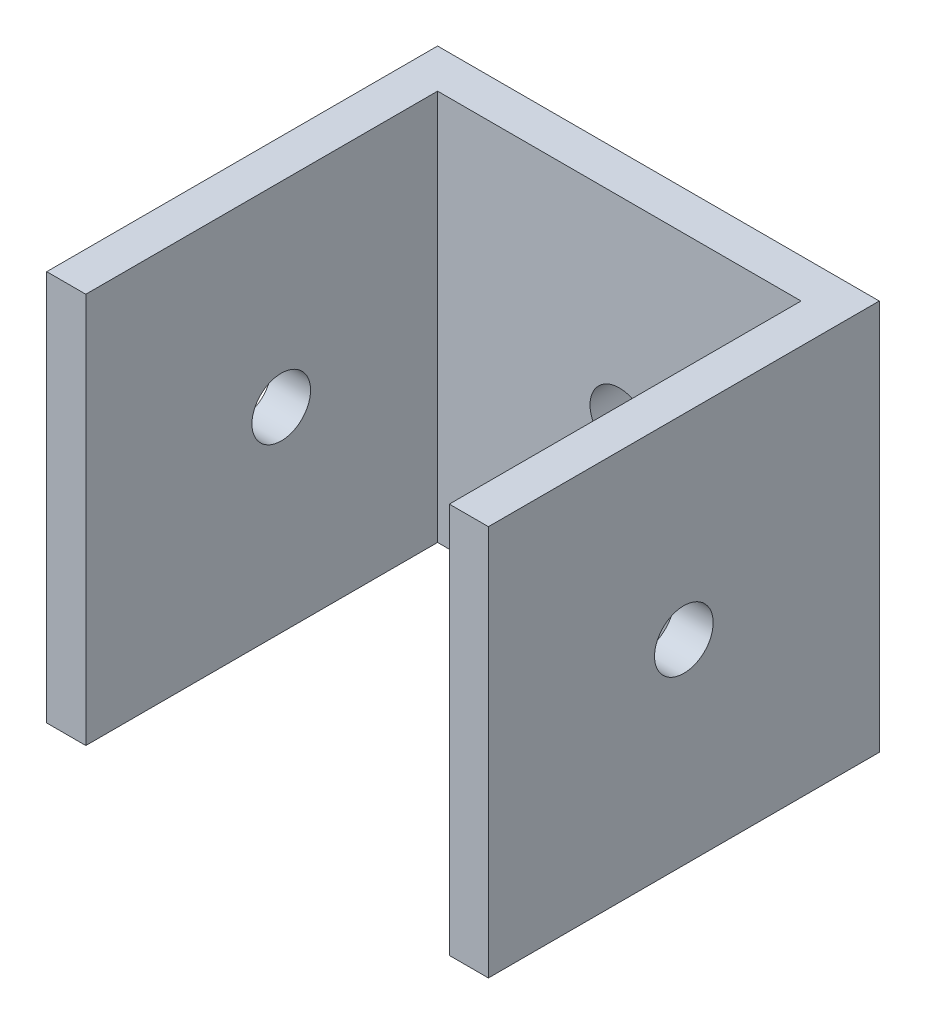
ISO-10303-21;
HEADER;
FILE_DESCRIPTION(('STEP AP214'),'2;1');
FILE_NAME('part.step','',(''),(''),'','','');
FILE_SCHEMA(('AUTOMOTIVE_DESIGN { 1 0 10303 214 1 1 1 1 }'));
ENDSEC;
DATA;
#1=APPLICATION_CONTEXT('core data for automotive mechanical design processes');
#2=APPLICATION_PROTOCOL_DEFINITION('international standard','automotive_design',2000,#1);
#3=PRODUCT_CONTEXT('',#1,'mechanical');
#4=PRODUCT('Part','Part','',(#3));
#5=PRODUCT_RELATED_PRODUCT_CATEGORY('part','',(#4));
#6=PRODUCT_DEFINITION_FORMATION('','',#4);
#7=PRODUCT_DEFINITION_CONTEXT('part definition',#1,'design');
#8=PRODUCT_DEFINITION('design','',#6,#7);
#9=PRODUCT_DEFINITION_SHAPE('','',#8);
#10=(LENGTH_UNIT() NAMED_UNIT(*) SI_UNIT(.MILLI.,.METRE.));
#11=(NAMED_UNIT(*) PLANE_ANGLE_UNIT() SI_UNIT($,.RADIAN.));
#12=(NAMED_UNIT(*) SI_UNIT($,.STERADIAN.) SOLID_ANGLE_UNIT());
#13=UNCERTAINTY_MEASURE_WITH_UNIT(LENGTH_MEASURE(1.E-05),#10,'distance_accuracy_value','');
#14=(GEOMETRIC_REPRESENTATION_CONTEXT(3) GLOBAL_UNCERTAINTY_ASSIGNED_CONTEXT((#13)) GLOBAL_UNIT_ASSIGNED_CONTEXT((#10,
#11,#12)) REPRESENTATION_CONTEXT('',''));
#15=CARTESIAN_POINT('',(0.,0.,0.));
#16=DIRECTION('',(0.,0.,1.));
#17=DIRECTION('',(1.,0.,0.));
#18=AXIS2_PLACEMENT_3D('',#15,#16,#17);
#19=CARTESIAN_POINT('',(-56.5,100.,0.));
#20=DIRECTION('',(1.,0.,0.));
#21=DIRECTION('',(0.,0.,-1.));
#22=AXIS2_PLACEMENT_3D('',#19,#20,#21);
#23=PLANE('',#22);
#24=CARTESIAN_POINT('',(-56.5,50.,50.));
#25=DIRECTION('',(1.,0.,0.));
#26=DIRECTION('',(0.,0.,-1.));
#27=AXIS2_PLACEMENT_3D('',#24,#25,#26);
#28=CIRCLE('',#27,7.5);
#29=CARTESIAN_POINT('',(-56.5,50.,42.5));
#30=VERTEX_POINT('',#29);
#31=EDGE_CURVE('E137',#30,#30,#28,.T.);
#32=ORIENTED_EDGE('',*,*,#31,.T.);
#33=EDGE_LOOP('',(#32));
#34=FACE_BOUND('',#33,.T.);
#35=DIRECTION('',(0.,0.,1.));
#36=VECTOR('',#35,1.);
#37=CARTESIAN_POINT('',(-56.5,0.,0.));
#38=LINE('',#37,#36);
#39=CARTESIAN_POINT('',(-56.5,0.,0.));
#40=VERTEX_POINT('',#39);
#41=CARTESIAN_POINT('',(-56.5,0.,100.));
#42=VERTEX_POINT('',#41);
#43=EDGE_CURVE('E133',#40,#42,#38,.T.);
#44=ORIENTED_EDGE('',*,*,#43,.T.);
#45=DIRECTION('',(0.,-1.,0.));
#46=VECTOR('',#45,1.);
#47=CARTESIAN_POINT('',(-56.5,100.,100.));
#48=LINE('',#47,#46);
#49=CARTESIAN_POINT('',(-56.5,100.,100.));
#50=VERTEX_POINT('',#49);
#51=EDGE_CURVE('E11',#50,#42,#48,.T.);
#52=ORIENTED_EDGE('',*,*,#51,.F.);
#53=DIRECTION('',(0.,0.,1.));
#54=VECTOR('',#53,1.);
#55=CARTESIAN_POINT('',(-56.5,100.,0.));
#56=LINE('',#55,#54);
#57=CARTESIAN_POINT('',(-56.5,100.,0.));
#58=VERTEX_POINT('',#57);
#59=EDGE_CURVE('E148',#58,#50,#56,.T.);
#60=ORIENTED_EDGE('',*,*,#59,.F.);
#61=DIRECTION('',(0.,-1.,0.));
#62=VECTOR('',#61,1.);
#63=CARTESIAN_POINT('',(-56.5,100.,0.));
#64=LINE('',#63,#62);
#65=EDGE_CURVE('E129',#58,#40,#64,.T.);
#66=ORIENTED_EDGE('',*,*,#65,.T.);
#67=EDGE_LOOP('',(#44,#52,#60,#66));
#68=FACE_BOUND('',#67,.T.);
#69=ADVANCED_FACE('F37',(#34,#68),#23,.F.);
#70=CARTESIAN_POINT('',(-56.5,100.,100.));
#71=DIRECTION('',(0.,0.,-1.));
#72=DIRECTION('',(-1.,0.,0.));
#73=AXIS2_PLACEMENT_3D('',#70,#71,#72);
#74=PLANE('',#73);
#75=DIRECTION('',(1.,0.,0.));
#76=VECTOR('',#75,1.);
#77=CARTESIAN_POINT('',(-56.5,0.,100.));
#78=LINE('',#77,#76);
#79=CARTESIAN_POINT('',(-46.5,0.,100.));
#80=VERTEX_POINT('',#79);
#81=EDGE_CURVE('E136',#42,#80,#78,.T.);
#82=ORIENTED_EDGE('',*,*,#81,.T.);
#83=DIRECTION('',(0.,-1.,0.));
#84=VECTOR('',#83,1.);
#85=CARTESIAN_POINT('',(-46.5,100.,100.));
#86=LINE('',#85,#84);
#87=CARTESIAN_POINT('',(-46.5,100.,100.));
#88=VERTEX_POINT('',#87);
#89=EDGE_CURVE('E45',#88,#80,#86,.T.);
#90=ORIENTED_EDGE('',*,*,#89,.F.);
#91=DIRECTION('',(1.,0.,0.));
#92=VECTOR('',#91,1.);
#93=CARTESIAN_POINT('',(-56.5,100.,100.));
#94=LINE('',#93,#92);
#95=EDGE_CURVE('E96',#50,#88,#94,.T.);
#96=ORIENTED_EDGE('',*,*,#95,.F.);
#97=ORIENTED_EDGE('',*,*,#51,.T.);
#98=EDGE_LOOP('',(#82,#90,#96,#97));
#99=FACE_BOUND('',#98,.T.);
#100=ADVANCED_FACE('F214',(#99),#74,.F.);
#101=CARTESIAN_POINT('',(-46.5,100.,100.));
#102=DIRECTION('',(-1.,0.,0.));
#103=DIRECTION('',(0.,0.,1.));
#104=AXIS2_PLACEMENT_3D('',#101,#102,#103);
#105=PLANE('',#104);
#106=CARTESIAN_POINT('',(-46.5,50.,50.));
#107=DIRECTION('',(-1.,0.,0.));
#108=DIRECTION('',(0.,0.,1.));
#109=AXIS2_PLACEMENT_3D('',#106,#107,#108);
#110=CIRCLE('',#109,7.5);
#111=CARTESIAN_POINT('',(-46.5,50.,57.5));
#112=VERTEX_POINT('',#111);
#113=EDGE_CURVE('E183',#112,#112,#110,.T.);
#114=ORIENTED_EDGE('',*,*,#113,.T.);
#115=EDGE_LOOP('',(#114));
#116=FACE_BOUND('',#115,.T.);
#117=DIRECTION('',(0.,0.,-1.));
#118=VECTOR('',#117,1.);
#119=CARTESIAN_POINT('',(-46.5,0.,100.));
#120=LINE('',#119,#118);
#121=CARTESIAN_POINT('',(-46.5,0.,9.99999999999999));
#122=VERTEX_POINT('',#121);
#123=EDGE_CURVE('E139',#80,#122,#120,.T.);
#124=ORIENTED_EDGE('',*,*,#123,.T.);
#125=DIRECTION('',(0.,-1.,0.));
#126=VECTOR('',#125,1.);
#127=CARTESIAN_POINT('',(-46.5,100.,9.99999999999999));
#128=LINE('',#127,#126);
#129=CARTESIAN_POINT('',(-46.5,100.,9.99999999999999));
#130=VERTEX_POINT('',#129);
#131=EDGE_CURVE('E155',#130,#122,#128,.T.);
#132=ORIENTED_EDGE('',*,*,#131,.F.);
#133=DIRECTION('',(0.,0.,-1.));
#134=VECTOR('',#133,1.);
#135=CARTESIAN_POINT('',(-46.5,100.,100.));
#136=LINE('',#135,#134);
#137=EDGE_CURVE('E163',#88,#130,#136,.T.);
#138=ORIENTED_EDGE('',*,*,#137,.F.);
#139=ORIENTED_EDGE('',*,*,#89,.T.);
#140=EDGE_LOOP('',(#124,#132,#138,#139));
#141=FACE_BOUND('',#140,.T.);
#142=ADVANCED_FACE('F161',(#116,#141),#105,.F.);
#143=CARTESIAN_POINT('',(46.5,100.,9.99999999999998));
#144=DIRECTION('',(0.,0.,-1.));
#145=DIRECTION('',(-1.,0.,0.));
#146=AXIS2_PLACEMENT_3D('',#143,#144,#145);
#147=PLANE('',#146);
#148=CARTESIAN_POINT('',(0.,50.,9.99999999999998));
#149=DIRECTION('',(0.,0.,-1.));
#150=DIRECTION('',(-1.,0.,0.));
#151=AXIS2_PLACEMENT_3D('',#148,#149,#150);
#152=CIRCLE('',#151,7.5);
#153=CARTESIAN_POINT('',(-7.49999999999999,50.,9.99999999999998));
#154=VERTEX_POINT('',#153);
#155=EDGE_CURVE('E192',#154,#154,#152,.T.);
#156=ORIENTED_EDGE('',*,*,#155,.T.);
#157=EDGE_LOOP('',(#156));
#158=FACE_BOUND('',#157,.T.);
#159=DIRECTION('',(1.,0.,0.));
#160=VECTOR('',#159,1.);
#161=CARTESIAN_POINT('',(46.5,0.,9.99999999999998));
#162=LINE('',#161,#160);
#163=CARTESIAN_POINT('',(46.5,0.,9.99999999999998));
#164=VERTEX_POINT('',#163);
#165=EDGE_CURVE('E141',#122,#164,#162,.T.);
#166=ORIENTED_EDGE('',*,*,#165,.T.);
#167=DIRECTION('',(0.,-1.,0.));
#168=VECTOR('',#167,1.);
#169=CARTESIAN_POINT('',(46.5,100.,9.99999999999998));
#170=LINE('',#169,#168);
#171=CARTESIAN_POINT('',(46.5,100.,9.99999999999998));
#172=VERTEX_POINT('',#171);
#173=EDGE_CURVE('E152',#172,#164,#170,.T.);
#174=ORIENTED_EDGE('',*,*,#173,.F.);
#175=DIRECTION('',(1.,0.,0.));
#176=VECTOR('',#175,1.);
#177=CARTESIAN_POINT('',(46.5,100.,9.99999999999998));
#178=LINE('',#177,#176);
#179=EDGE_CURVE('E175',#130,#172,#178,.T.);
#180=ORIENTED_EDGE('',*,*,#179,.F.);
#181=ORIENTED_EDGE('',*,*,#131,.T.);
#182=EDGE_LOOP('',(#166,#174,#180,#181));
#183=FACE_BOUND('',#182,.T.);
#184=ADVANCED_FACE('F171',(#158,#183),#147,.F.);
#185=CARTESIAN_POINT('',(46.5,100.,100.));
#186=DIRECTION('',(1.,0.,0.));
#187=DIRECTION('',(0.,0.,-1.));
#188=AXIS2_PLACEMENT_3D('',#185,#186,#187);
#189=PLANE('',#188);
#190=CARTESIAN_POINT('',(46.5,50.,50.));
#191=DIRECTION('',(1.,0.,0.));
#192=DIRECTION('',(0.,0.,-1.));
#193=AXIS2_PLACEMENT_3D('',#190,#191,#192);
#194=CIRCLE('',#193,7.5);
#195=CARTESIAN_POINT('',(46.5,50.,42.5));
#196=VERTEX_POINT('',#195);
#197=EDGE_CURVE('E186',#196,#196,#194,.T.);
#198=ORIENTED_EDGE('',*,*,#197,.T.);
#199=EDGE_LOOP('',(#198));
#200=FACE_BOUND('',#199,.T.);
#201=DIRECTION('',(0.,0.,1.));
#202=VECTOR('',#201,1.);
#203=CARTESIAN_POINT('',(46.5,0.,100.));
#204=LINE('',#203,#202);
#205=CARTESIAN_POINT('',(46.5,0.,100.));
#206=VERTEX_POINT('',#205);
#207=EDGE_CURVE('E143',#164,#206,#204,.T.);
#208=ORIENTED_EDGE('',*,*,#207,.T.);
#209=DIRECTION('',(0.,-1.,0.));
#210=VECTOR('',#209,1.);
#211=CARTESIAN_POINT('',(46.5,100.,100.));
#212=LINE('',#211,#210);
#213=CARTESIAN_POINT('',(46.5,100.,100.));
#214=VERTEX_POINT('',#213);
#215=EDGE_CURVE('E124',#214,#206,#212,.T.);
#216=ORIENTED_EDGE('',*,*,#215,.F.);
#217=DIRECTION('',(0.,0.,1.));
#218=VECTOR('',#217,1.);
#219=CARTESIAN_POINT('',(46.5,100.,100.));
#220=LINE('',#219,#218);
#221=EDGE_CURVE('E115',#172,#214,#220,.T.);
#222=ORIENTED_EDGE('',*,*,#221,.F.);
#223=ORIENTED_EDGE('',*,*,#173,.T.);
#224=EDGE_LOOP('',(#208,#216,#222,#223));
#225=FACE_BOUND('',#224,.T.);
#226=ADVANCED_FACE('F174',(#200,#225),#189,.F.);
#227=CARTESIAN_POINT('',(56.5,100.,100.));
#228=DIRECTION('',(0.,0.,-1.));
#229=DIRECTION('',(-1.,0.,0.));
#230=AXIS2_PLACEMENT_3D('',#227,#228,#229);
#231=PLANE('',#230);
#232=DIRECTION('',(1.,0.,0.));
#233=VECTOR('',#232,1.);
#234=CARTESIAN_POINT('',(56.5,0.,100.));
#235=LINE('',#234,#233);
#236=CARTESIAN_POINT('',(56.5,0.,100.));
#237=VERTEX_POINT('',#236);
#238=EDGE_CURVE('E123',#206,#237,#235,.T.);
#239=ORIENTED_EDGE('',*,*,#238,.T.);
#240=DIRECTION('',(0.,-1.,0.));
#241=VECTOR('',#240,1.);
#242=CARTESIAN_POINT('',(56.5,100.,100.));
#243=LINE('',#242,#241);
#244=CARTESIAN_POINT('',(56.5,100.,100.));
#245=VERTEX_POINT('',#244);
#246=EDGE_CURVE('E120',#245,#237,#243,.T.);
#247=ORIENTED_EDGE('',*,*,#246,.F.);
#248=DIRECTION('',(1.,0.,0.));
#249=VECTOR('',#248,1.);
#250=CARTESIAN_POINT('',(56.5,100.,100.));
#251=LINE('',#250,#249);
#252=EDGE_CURVE('E109',#214,#245,#251,.T.);
#253=ORIENTED_EDGE('',*,*,#252,.F.);
#254=ORIENTED_EDGE('',*,*,#215,.T.);
#255=EDGE_LOOP('',(#239,#247,#253,#254));
#256=FACE_BOUND('',#255,.T.);
#257=ADVANCED_FACE('F121',(#256),#231,.F.);
#258=CARTESIAN_POINT('',(56.5,100.,0.));
#259=DIRECTION('',(-1.,0.,0.));
#260=DIRECTION('',(0.,0.,1.));
#261=AXIS2_PLACEMENT_3D('',#258,#259,#260);
#262=PLANE('',#261);
#263=CARTESIAN_POINT('',(56.5,50.,50.));
#264=DIRECTION('',(1.,0.,0.));
#265=DIRECTION('',(0.,0.,-1.));
#266=AXIS2_PLACEMENT_3D('',#263,#264,#265);
#267=CIRCLE('',#266,7.5);
#268=CARTESIAN_POINT('',(56.5,50.,42.5));
#269=VERTEX_POINT('',#268);
#270=EDGE_CURVE('E189',#269,#269,#267,.T.);
#271=ORIENTED_EDGE('',*,*,#270,.F.);
#272=EDGE_LOOP('',(#271));
#273=FACE_BOUND('',#272,.T.);
#274=DIRECTION('',(0.,0.,-1.));
#275=VECTOR('',#274,1.);
#276=CARTESIAN_POINT('',(56.5,0.,0.));
#277=LINE('',#276,#275);
#278=CARTESIAN_POINT('',(56.5,0.,0.));
#279=VERTEX_POINT('',#278);
#280=EDGE_CURVE('E82',#237,#279,#277,.T.);
#281=ORIENTED_EDGE('',*,*,#280,.T.);
#282=DIRECTION('',(0.,-1.,0.));
#283=VECTOR('',#282,1.);
#284=CARTESIAN_POINT('',(56.5,100.,0.));
#285=LINE('',#284,#283);
#286=CARTESIAN_POINT('',(56.5,100.,0.));
#287=VERTEX_POINT('',#286);
#288=EDGE_CURVE('E125',#287,#279,#285,.T.);
#289=ORIENTED_EDGE('',*,*,#288,.F.);
#290=DIRECTION('',(0.,0.,-1.));
#291=VECTOR('',#290,1.);
#292=CARTESIAN_POINT('',(56.5,100.,0.));
#293=LINE('',#292,#291);
#294=EDGE_CURVE('E113',#245,#287,#293,.T.);
#295=ORIENTED_EDGE('',*,*,#294,.F.);
#296=ORIENTED_EDGE('',*,*,#246,.T.);
#297=EDGE_LOOP('',(#281,#289,#295,#296));
#298=FACE_BOUND('',#297,.T.);
#299=ADVANCED_FACE('F127',(#273,#298),#262,.F.);
#300=CARTESIAN_POINT('',(-56.5,100.,0.));
#301=DIRECTION('',(0.,0.,1.));
#302=DIRECTION('',(1.,0.,0.));
#303=AXIS2_PLACEMENT_3D('',#300,#301,#302);
#304=PLANE('',#303);
#305=CARTESIAN_POINT('',(0.,50.,0.));
#306=DIRECTION('',(0.,0.,-1.));
#307=DIRECTION('',(-1.,0.,0.));
#308=AXIS2_PLACEMENT_3D('',#305,#306,#307);
#309=CIRCLE('',#308,7.5);
#310=CARTESIAN_POINT('',(-7.49999999999999,50.,0.));
#311=VERTEX_POINT('',#310);
#312=EDGE_CURVE('E195',#311,#311,#309,.T.);
#313=ORIENTED_EDGE('',*,*,#312,.F.);
#314=EDGE_LOOP('',(#313));
#315=FACE_BOUND('',#314,.T.);
#316=DIRECTION('',(-1.,0.,0.));
#317=VECTOR('',#316,1.);
#318=CARTESIAN_POINT('',(-56.5,0.,0.));
#319=LINE('',#318,#317);
#320=EDGE_CURVE('E88',#279,#40,#319,.T.);
#321=ORIENTED_EDGE('',*,*,#320,.T.);
#322=ORIENTED_EDGE('',*,*,#65,.F.);
#323=DIRECTION('',(-1.,0.,0.));
#324=VECTOR('',#323,1.);
#325=CARTESIAN_POINT('',(-56.5,100.,0.));
#326=LINE('',#325,#324);
#327=EDGE_CURVE('E53',#287,#58,#326,.T.);
#328=ORIENTED_EDGE('',*,*,#327,.F.);
#329=ORIENTED_EDGE('',*,*,#288,.T.);
#330=EDGE_LOOP('',(#321,#322,#328,#329));
#331=FACE_BOUND('',#330,.T.);
#332=ADVANCED_FACE('F202',(#315,#331),#304,.F.);
#333=CARTESIAN_POINT('',(0.,100.,0.));
#334=DIRECTION('',(0.,1.,0.));
#335=DIRECTION('',(0.,0.,1.));
#336=AXIS2_PLACEMENT_3D('',#333,#334,#335);
#337=PLANE('',#336);
#338=ORIENTED_EDGE('',*,*,#59,.T.);
#339=ORIENTED_EDGE('',*,*,#95,.T.);
#340=ORIENTED_EDGE('',*,*,#137,.T.);
#341=ORIENTED_EDGE('',*,*,#179,.T.);
#342=ORIENTED_EDGE('',*,*,#221,.T.);
#343=ORIENTED_EDGE('',*,*,#252,.T.);
#344=ORIENTED_EDGE('',*,*,#294,.T.);
#345=ORIENTED_EDGE('',*,*,#327,.T.);
#346=EDGE_LOOP('',(#338,#339,#340,#341,#342,#343,#344,#345));
#347=FACE_BOUND('',#346,.T.);
#348=ADVANCED_FACE('F111',(#347),#337,.T.);
#349=CARTESIAN_POINT('',(0.,0.,0.));
#350=DIRECTION('',(0.,1.,0.));
#351=DIRECTION('',(0.,0.,1.));
#352=AXIS2_PLACEMENT_3D('',#349,#350,#351);
#353=PLANE('',#352);
#354=ORIENTED_EDGE('',*,*,#43,.F.);
#355=ORIENTED_EDGE('',*,*,#320,.F.);
#356=ORIENTED_EDGE('',*,*,#280,.F.);
#357=ORIENTED_EDGE('',*,*,#238,.F.);
#358=ORIENTED_EDGE('',*,*,#207,.F.);
#359=ORIENTED_EDGE('',*,*,#165,.F.);
#360=ORIENTED_EDGE('',*,*,#123,.F.);
#361=ORIENTED_EDGE('',*,*,#81,.F.);
#362=EDGE_LOOP('',(#354,#355,#356,#357,#358,#359,#360,#361));
#363=FACE_BOUND('',#362,.T.);
#364=ADVANCED_FACE('F167',(#363),#353,.F.);
#365=CARTESIAN_POINT('',(-83.5,50.,50.));
#366=DIRECTION('',(1.,0.,0.));
#367=DIRECTION('',(0.,0.,-1.));
#368=AXIS2_PLACEMENT_3D('',#365,#366,#367);
#369=CYLINDRICAL_SURFACE('',#368,7.5);
#370=ORIENTED_EDGE('',*,*,#270,.T.);
#371=EDGE_LOOP('',(#370));
#372=FACE_BOUND('',#371,.T.);
#373=ORIENTED_EDGE('',*,*,#197,.F.);
#374=EDGE_LOOP('',(#373));
#375=FACE_BOUND('',#374,.T.);
#376=ADVANCED_FACE('F226',(#372,#375),#369,.F.);
#377=ORIENTED_EDGE('',*,*,#113,.F.);
#378=EDGE_LOOP('',(#377));
#379=FACE_BOUND('',#378,.T.);
#380=ORIENTED_EDGE('',*,*,#31,.F.);
#381=EDGE_LOOP('',(#380));
#382=FACE_BOUND('',#381,.T.);
#383=ADVANCED_FACE('F224',(#379,#382),#369,.F.);
#384=CARTESIAN_POINT('',(0.,50.,140.));
#385=DIRECTION('',(0.,0.,-1.));
#386=DIRECTION('',(-1.,0.,0.));
#387=AXIS2_PLACEMENT_3D('',#384,#385,#386);
#388=CYLINDRICAL_SURFACE('',#387,7.5);
#389=ORIENTED_EDGE('',*,*,#312,.T.);
#390=EDGE_LOOP('',(#389));
#391=FACE_BOUND('',#390,.T.);
#392=ORIENTED_EDGE('',*,*,#155,.F.);
#393=EDGE_LOOP('',(#392));
#394=FACE_BOUND('',#393,.T.);
#395=ADVANCED_FACE('F199',(#391,#394),#388,.F.);
#396=CLOSED_SHELL('',(#69,#100,#142,#184,#226,#257,#299,#332,#348,#364,#376,#383,#395));
#397=MANIFOLD_SOLID_BREP('B2',#396);
#398=ADVANCED_BREP_SHAPE_REPRESENTATION('',(#18,#397),#14);
#399=SHAPE_DEFINITION_REPRESENTATION(#9,#398);
ENDSEC;
END-ISO-10303-21;
